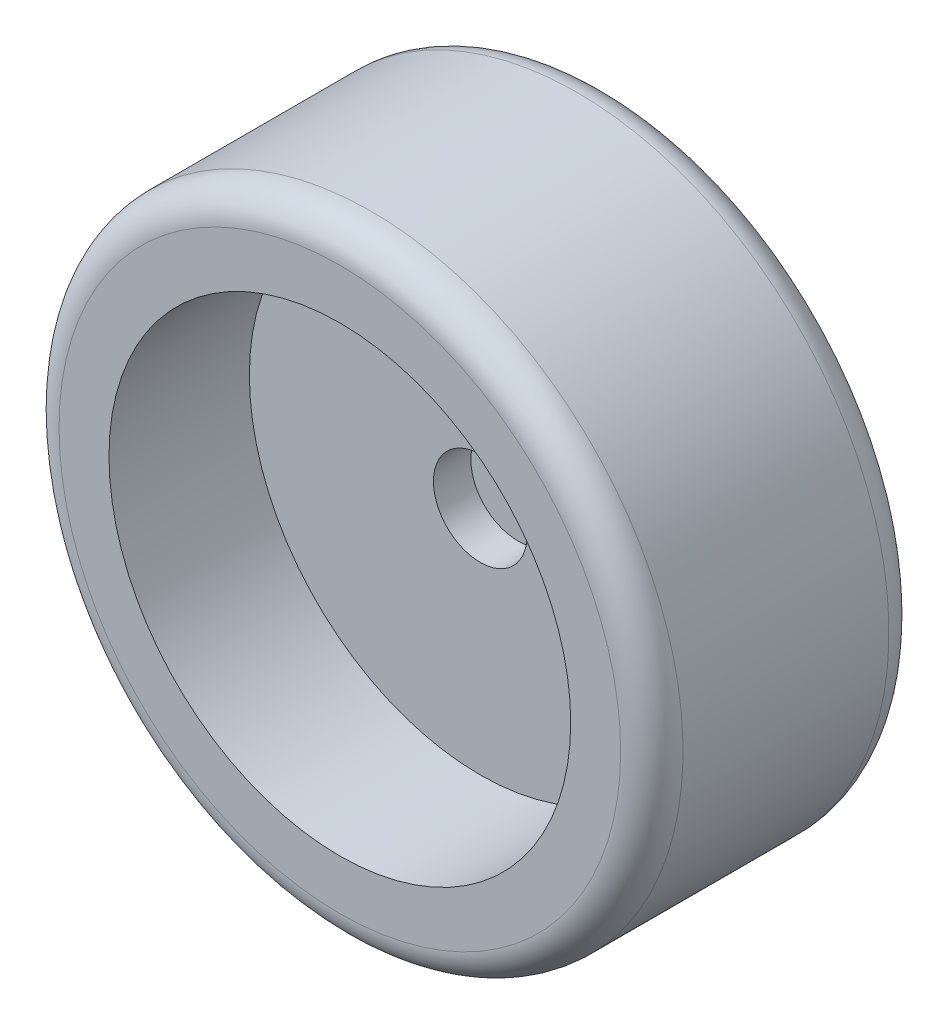
ISO-10303-21;
HEADER;
FILE_DESCRIPTION(('STEP AP214'),'2;1');
FILE_NAME('part.step','',(''),(''),'','','');
FILE_SCHEMA(('AUTOMOTIVE_DESIGN { 1 0 10303 214 1 1 1 1 }'));
ENDSEC;
DATA;
#1=APPLICATION_CONTEXT('core data for automotive mechanical design processes');
#2=APPLICATION_PROTOCOL_DEFINITION('international standard','automotive_design',2000,#1);
#3=PRODUCT_CONTEXT('',#1,'mechanical');
#4=PRODUCT('Part','Part','',(#3));
#5=PRODUCT_RELATED_PRODUCT_CATEGORY('part','',(#4));
#6=PRODUCT_DEFINITION_FORMATION('','',#4);
#7=PRODUCT_DEFINITION_CONTEXT('part definition',#1,'design');
#8=PRODUCT_DEFINITION('design','',#6,#7);
#9=PRODUCT_DEFINITION_SHAPE('','',#8);
#10=(LENGTH_UNIT() NAMED_UNIT(*) SI_UNIT(.MILLI.,.METRE.));
#11=(NAMED_UNIT(*) PLANE_ANGLE_UNIT() SI_UNIT($,.RADIAN.));
#12=(NAMED_UNIT(*) SI_UNIT($,.STERADIAN.) SOLID_ANGLE_UNIT());
#13=UNCERTAINTY_MEASURE_WITH_UNIT(LENGTH_MEASURE(1.E-05),#10,'distance_accuracy_value','');
#14=(GEOMETRIC_REPRESENTATION_CONTEXT(3) GLOBAL_UNCERTAINTY_ASSIGNED_CONTEXT((#13)) GLOBAL_UNIT_ASSIGNED_CONTEXT((#10,
#11,#12)) REPRESENTATION_CONTEXT('',''));
#15=CARTESIAN_POINT('',(0.,0.,0.));
#16=DIRECTION('',(0.,0.,1.));
#17=DIRECTION('',(1.,0.,0.));
#18=AXIS2_PLACEMENT_3D('',#15,#16,#17);
#19=CARTESIAN_POINT('',(0.,0.,43.));
#20=DIRECTION('',(0.,0.,-1.));
#21=DIRECTION('',(-1.,0.,0.));
#22=AXIS2_PLACEMENT_3D('',#19,#20,#21);
#23=CYLINDRICAL_SURFACE('',#22,7.5);
#24=CARTESIAN_POINT('',(0.,0.,14.5));
#25=DIRECTION('',(0.,0.,-1.));
#26=DIRECTION('',(-1.,0.,0.));
#27=AXIS2_PLACEMENT_3D('',#24,#25,#26);
#28=CIRCLE('',#27,7.5);
#29=CARTESIAN_POINT('',(-7.5,0.,14.5));
#30=VERTEX_POINT('',#29);
#31=EDGE_CURVE('E10',#30,#30,#28,.T.);
#32=ORIENTED_EDGE('',*,*,#31,.T.);
#33=EDGE_LOOP('',(#32));
#34=FACE_BOUND('',#33,.T.);
#35=CARTESIAN_POINT('',(0.,0.,20.5));
#36=DIRECTION('',(0.,0.,-1.));
#37=DIRECTION('',(-1.,0.,0.));
#38=AXIS2_PLACEMENT_3D('',#35,#36,#37);
#39=CIRCLE('',#38,7.5);
#40=CARTESIAN_POINT('',(-7.5,0.,20.5));
#41=VERTEX_POINT('',#40);
#42=EDGE_CURVE('E67',#41,#41,#39,.T.);
#43=ORIENTED_EDGE('',*,*,#42,.F.);
#44=EDGE_LOOP('',(#43));
#45=FACE_BOUND('',#44,.T.);
#46=ADVANCED_FACE('F39',(#34,#45),#23,.F.);
#47=CARTESIAN_POINT('',(7.5,0.,14.5));
#48=DIRECTION('',(0.,0.,1.));
#49=DIRECTION('',(1.,0.,0.));
#50=AXIS2_PLACEMENT_3D('',#47,#48,#49);
#51=PLANE('',#50);
#52=ORIENTED_EDGE('',*,*,#31,.F.);
#53=EDGE_LOOP('',(#52));
#54=FACE_BOUND('',#53,.T.);
#55=ADVANCED_FACE('F75',(#54),#51,.T.);
#56=CARTESIAN_POINT('',(0.,0.,0.));
#57=DIRECTION('',(0.,0.,-1.));
#58=DIRECTION('',(-1.,0.,0.));
#59=AXIS2_PLACEMENT_3D('',#56,#57,#58);
#60=PLANE('',#59);
#61=CARTESIAN_POINT('',(0.,0.,0.));
#62=DIRECTION('',(0.,0.,-1.));
#63=DIRECTION('',(-1.,0.,0.));
#64=AXIS2_PLACEMENT_3D('',#61,#62,#63);
#65=CIRCLE('',#64,45.);
#66=CARTESIAN_POINT('',(-45.,0.,0.));
#67=VERTEX_POINT('',#66);
#68=EDGE_CURVE('E45',#67,#67,#65,.T.);
#69=ORIENTED_EDGE('',*,*,#68,.T.);
#70=EDGE_LOOP('',(#69));
#71=FACE_BOUND('',#70,.T.);
#72=ADVANCED_FACE('F79',(#71),#60,.T.);
#73=CARTESIAN_POINT('',(0.,0.,5.));
#74=DIRECTION('',(0.,0.,-1.));
#75=DIRECTION('',(-1.,0.,0.));
#76=AXIS2_PLACEMENT_3D('',#73,#74,#75);
#77=TOROIDAL_SURFACE('',#76,45.,5.);
#78=CARTESIAN_POINT('',(0.,0.,5.));
#79=DIRECTION('',(0.,0.,-1.));
#80=DIRECTION('',(-1.,0.,0.));
#81=AXIS2_PLACEMENT_3D('',#78,#79,#80);
#82=CIRCLE('',#81,50.);
#83=CARTESIAN_POINT('',(-50.,0.,5.));
#84=VERTEX_POINT('',#83);
#85=EDGE_CURVE('E49',#84,#84,#82,.T.);
#86=ORIENTED_EDGE('',*,*,#85,.T.);
#87=EDGE_LOOP('',(#86));
#88=FACE_BOUND('',#87,.T.);
#89=ORIENTED_EDGE('',*,*,#68,.F.);
#90=EDGE_LOOP('',(#89));
#91=FACE_BOUND('',#90,.T.);
#92=ADVANCED_FACE('F84',(#88,#91),#77,.T.);
#93=CARTESIAN_POINT('',(0.,0.,43.));
#94=DIRECTION('',(0.,0.,-1.));
#95=DIRECTION('',(-1.,0.,0.));
#96=AXIS2_PLACEMENT_3D('',#93,#94,#95);
#97=CYLINDRICAL_SURFACE('',#96,50.);
#98=CARTESIAN_POINT('',(0.,0.,38.));
#99=DIRECTION('',(0.,0.,-1.));
#100=DIRECTION('',(-1.,0.,0.));
#101=AXIS2_PLACEMENT_3D('',#98,#99,#100);
#102=CIRCLE('',#101,50.);
#103=CARTESIAN_POINT('',(-50.,0.,38.));
#104=VERTEX_POINT('',#103);
#105=EDGE_CURVE('E53',#104,#104,#102,.T.);
#106=ORIENTED_EDGE('',*,*,#105,.T.);
#107=EDGE_LOOP('',(#106));
#108=FACE_BOUND('',#107,.T.);
#109=ORIENTED_EDGE('',*,*,#85,.F.);
#110=EDGE_LOOP('',(#109));
#111=FACE_BOUND('',#110,.T.);
#112=ADVANCED_FACE('F89',(#108,#111),#97,.T.);
#113=CARTESIAN_POINT('',(0.,0.,38.));
#114=DIRECTION('',(0.,0.,-1.));
#115=DIRECTION('',(-1.,0.,0.));
#116=AXIS2_PLACEMENT_3D('',#113,#114,#115);
#117=TOROIDAL_SURFACE('',#116,45.,5.);
#118=CARTESIAN_POINT('',(0.,0.,43.));
#119=DIRECTION('',(0.,0.,-1.));
#120=DIRECTION('',(-1.,0.,0.));
#121=AXIS2_PLACEMENT_3D('',#118,#119,#120);
#122=CIRCLE('',#121,45.);
#123=CARTESIAN_POINT('',(-45.,0.,43.));
#124=VERTEX_POINT('',#123);
#125=EDGE_CURVE('E58',#124,#124,#122,.T.);
#126=ORIENTED_EDGE('',*,*,#125,.T.);
#127=EDGE_LOOP('',(#126));
#128=FACE_BOUND('',#127,.T.);
#129=ORIENTED_EDGE('',*,*,#105,.F.);
#130=EDGE_LOOP('',(#129));
#131=FACE_BOUND('',#130,.T.);
#132=ADVANCED_FACE('F93',(#128,#131),#117,.T.);
#133=CARTESIAN_POINT('',(45.,0.,43.));
#134=DIRECTION('',(0.,0.,1.));
#135=DIRECTION('',(1.,0.,0.));
#136=AXIS2_PLACEMENT_3D('',#133,#134,#135);
#137=PLANE('',#136);
#138=CARTESIAN_POINT('',(0.,0.,43.));
#139=DIRECTION('',(0.,0.,-1.));
#140=DIRECTION('',(-1.,0.,0.));
#141=AXIS2_PLACEMENT_3D('',#138,#139,#140);
#142=CIRCLE('',#141,37.);
#143=CARTESIAN_POINT('',(-37.,0.,43.));
#144=VERTEX_POINT('',#143);
#145=EDGE_CURVE('E61',#144,#144,#142,.T.);
#146=ORIENTED_EDGE('',*,*,#145,.T.);
#147=EDGE_LOOP('',(#146));
#148=FACE_BOUND('',#147,.T.);
#149=ORIENTED_EDGE('',*,*,#125,.F.);
#150=EDGE_LOOP('',(#149));
#151=FACE_BOUND('',#150,.T.);
#152=ADVANCED_FACE('F97',(#148,#151),#137,.T.);
#153=CARTESIAN_POINT('',(0.,0.,43.));
#154=DIRECTION('',(0.,0.,-1.));
#155=DIRECTION('',(-1.,0.,0.));
#156=AXIS2_PLACEMENT_3D('',#153,#154,#155);
#157=CYLINDRICAL_SURFACE('',#156,37.);
#158=CARTESIAN_POINT('',(0.,0.,20.5));
#159=DIRECTION('',(0.,0.,-1.));
#160=DIRECTION('',(-1.,0.,0.));
#161=AXIS2_PLACEMENT_3D('',#158,#159,#160);
#162=CIRCLE('',#161,37.);
#163=CARTESIAN_POINT('',(-37.,0.,20.5));
#164=VERTEX_POINT('',#163);
#165=EDGE_CURVE('E64',#164,#164,#162,.T.);
#166=ORIENTED_EDGE('',*,*,#165,.T.);
#167=EDGE_LOOP('',(#166));
#168=FACE_BOUND('',#167,.T.);
#169=ORIENTED_EDGE('',*,*,#145,.F.);
#170=EDGE_LOOP('',(#169));
#171=FACE_BOUND('',#170,.T.);
#172=ADVANCED_FACE('F101',(#168,#171),#157,.F.);
#173=CARTESIAN_POINT('',(37.,0.,20.5));
#174=DIRECTION('',(0.,0.,1.));
#175=DIRECTION('',(1.,0.,0.));
#176=AXIS2_PLACEMENT_3D('',#173,#174,#175);
#177=PLANE('',#176);
#178=ORIENTED_EDGE('',*,*,#42,.T.);
#179=EDGE_LOOP('',(#178));
#180=FACE_BOUND('',#179,.T.);
#181=ORIENTED_EDGE('',*,*,#165,.F.);
#182=EDGE_LOOP('',(#181));
#183=FACE_BOUND('',#182,.T.);
#184=ADVANCED_FACE('F71',(#180,#183),#177,.T.);
#185=CLOSED_SHELL('',(#46,#55,#72,#92,#112,#132,#152,#172,#184));
#186=MANIFOLD_SOLID_BREP('B2',#185);
#187=ADVANCED_BREP_SHAPE_REPRESENTATION('',(#18,#186),#14);
#188=SHAPE_DEFINITION_REPRESENTATION(#9,#187);
ENDSEC;
END-ISO-10303-21;
